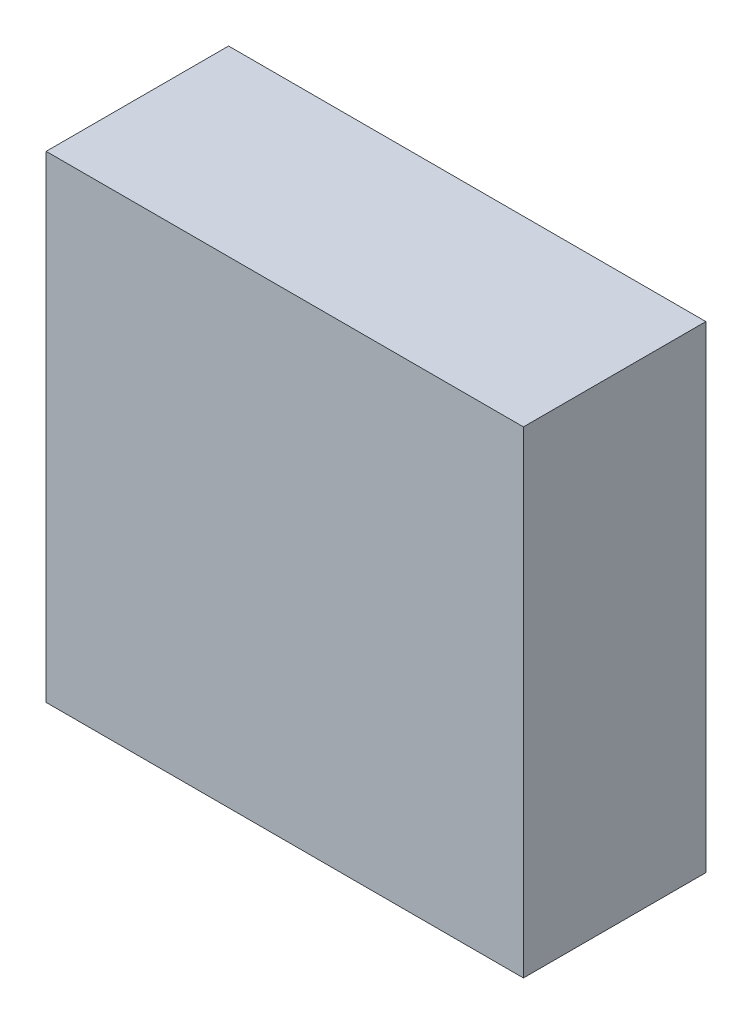
ISO-10303-21;
HEADER;
FILE_DESCRIPTION(('STEP AP214'),'2;1');
FILE_NAME('part.step','',(''),(''),'','','');
FILE_SCHEMA(('AUTOMOTIVE_DESIGN { 1 0 10303 214 1 1 1 1 }'));
ENDSEC;
DATA;
#1=APPLICATION_CONTEXT('core data for automotive mechanical design processes');
#2=APPLICATION_PROTOCOL_DEFINITION('international standard','automotive_design',2000,#1);
#3=PRODUCT_CONTEXT('',#1,'mechanical');
#4=PRODUCT('Part','Part','',(#3));
#5=PRODUCT_RELATED_PRODUCT_CATEGORY('part','',(#4));
#6=PRODUCT_DEFINITION_FORMATION('','',#4);
#7=PRODUCT_DEFINITION_CONTEXT('part definition',#1,'design');
#8=PRODUCT_DEFINITION('design','',#6,#7);
#9=PRODUCT_DEFINITION_SHAPE('','',#8);
#10=(LENGTH_UNIT() NAMED_UNIT(*) SI_UNIT(.MILLI.,.METRE.));
#11=(NAMED_UNIT(*) PLANE_ANGLE_UNIT() SI_UNIT($,.RADIAN.));
#12=(NAMED_UNIT(*) SI_UNIT($,.STERADIAN.) SOLID_ANGLE_UNIT());
#13=UNCERTAINTY_MEASURE_WITH_UNIT(LENGTH_MEASURE(1.E-05),#10,'distance_accuracy_value','');
#14=(GEOMETRIC_REPRESENTATION_CONTEXT(3) GLOBAL_UNCERTAINTY_ASSIGNED_CONTEXT((#13)) GLOBAL_UNIT_ASSIGNED_CONTEXT((#10,
#11,#12)) REPRESENTATION_CONTEXT('',''));
#15=CARTESIAN_POINT('',(0.,0.,0.));
#16=DIRECTION('',(0.,0.,1.));
#17=DIRECTION('',(1.,0.,0.));
#18=AXIS2_PLACEMENT_3D('',#15,#16,#17);
#19=CARTESIAN_POINT('',(-1.27,-1.27,1.));
#20=DIRECTION('',(1.,0.,0.));
#21=DIRECTION('',(0.,0.,-1.));
#22=AXIS2_PLACEMENT_3D('',#19,#20,#21);
#23=PLANE('',#22);
#24=DIRECTION('',(0.,-1.,0.));
#25=VECTOR('',#24,1.);
#26=CARTESIAN_POINT('',(-1.27,-1.27,0.));
#27=LINE('',#26,#25);
#28=CARTESIAN_POINT('',(-1.27,1.3462,0.));
#29=VERTEX_POINT('',#28);
#30=CARTESIAN_POINT('',(-1.27,-1.27,0.));
#31=VERTEX_POINT('',#30);
#32=EDGE_CURVE('E95',#29,#31,#27,.T.);
#33=ORIENTED_EDGE('',*,*,#32,.T.);
#34=DIRECTION('',(0.,0.,-1.));
#35=VECTOR('',#34,1.);
#36=CARTESIAN_POINT('',(-1.27,-1.27,1.));
#37=LINE('',#36,#35);
#38=CARTESIAN_POINT('',(-1.27,-1.27,1.));
#39=VERTEX_POINT('',#38);
#40=EDGE_CURVE('E11',#39,#31,#37,.T.);
#41=ORIENTED_EDGE('',*,*,#40,.F.);
#42=DIRECTION('',(0.,-1.,0.));
#43=VECTOR('',#42,1.);
#44=CARTESIAN_POINT('',(-1.27,-1.27,1.));
#45=LINE('',#44,#43);
#46=CARTESIAN_POINT('',(-1.27,1.3462,1.));
#47=VERTEX_POINT('',#46);
#48=EDGE_CURVE('E83',#47,#39,#45,.T.);
#49=ORIENTED_EDGE('',*,*,#48,.F.);
#50=DIRECTION('',(0.,0.,-1.));
#51=VECTOR('',#50,1.);
#52=CARTESIAN_POINT('',(-1.27,1.3462,1.));
#53=LINE('',#52,#51);
#54=EDGE_CURVE('E91',#47,#29,#53,.T.);
#55=ORIENTED_EDGE('',*,*,#54,.T.);
#56=EDGE_LOOP('',(#33,#41,#49,#55));
#57=FACE_BOUND('',#56,.T.);
#58=ADVANCED_FACE('F32',(#57),#23,.F.);
#59=CARTESIAN_POINT('',(1.3462,-1.27,1.));
#60=DIRECTION('',(0.,1.,0.));
#61=DIRECTION('',(0.,0.,1.));
#62=AXIS2_PLACEMENT_3D('',#59,#60,#61);
#63=PLANE('',#62);
#64=DIRECTION('',(1.,0.,0.));
#65=VECTOR('',#64,1.);
#66=CARTESIAN_POINT('',(1.3462,-1.27,0.));
#67=LINE('',#66,#65);
#68=CARTESIAN_POINT('',(1.3462,-1.27,0.));
#69=VERTEX_POINT('',#68);
#70=EDGE_CURVE('E87',#31,#69,#67,.T.);
#71=ORIENTED_EDGE('',*,*,#70,.T.);
#72=DIRECTION('',(0.,0.,-1.));
#73=VECTOR('',#72,1.);
#74=CARTESIAN_POINT('',(1.3462,-1.27,1.));
#75=LINE('',#74,#73);
#76=CARTESIAN_POINT('',(1.3462,-1.27,1.));
#77=VERTEX_POINT('',#76);
#78=EDGE_CURVE('E40',#77,#69,#75,.T.);
#79=ORIENTED_EDGE('',*,*,#78,.F.);
#80=DIRECTION('',(1.,0.,0.));
#81=VECTOR('',#80,1.);
#82=CARTESIAN_POINT('',(1.3462,-1.27,1.));
#83=LINE('',#82,#81);
#84=EDGE_CURVE('E78',#39,#77,#83,.T.);
#85=ORIENTED_EDGE('',*,*,#84,.F.);
#86=ORIENTED_EDGE('',*,*,#40,.T.);
#87=EDGE_LOOP('',(#71,#79,#85,#86));
#88=FACE_BOUND('',#87,.T.);
#89=ADVANCED_FACE('F86',(#88),#63,.F.);
#90=CARTESIAN_POINT('',(1.3462,1.3462,1.));
#91=DIRECTION('',(-1.,0.,0.));
#92=DIRECTION('',(0.,0.,1.));
#93=AXIS2_PLACEMENT_3D('',#90,#91,#92);
#94=PLANE('',#93);
#95=DIRECTION('',(0.,1.,0.));
#96=VECTOR('',#95,1.);
#97=CARTESIAN_POINT('',(1.3462,1.3462,0.));
#98=LINE('',#97,#96);
#99=CARTESIAN_POINT('',(1.3462,1.3462,0.));
#100=VERTEX_POINT('',#99);
#101=EDGE_CURVE('E65',#69,#100,#98,.T.);
#102=ORIENTED_EDGE('',*,*,#101,.T.);
#103=DIRECTION('',(0.,0.,-1.));
#104=VECTOR('',#103,1.);
#105=CARTESIAN_POINT('',(1.3462,1.3462,1.));
#106=LINE('',#105,#104);
#107=CARTESIAN_POINT('',(1.3462,1.3462,1.));
#108=VERTEX_POINT('',#107);
#109=EDGE_CURVE('E88',#108,#100,#106,.T.);
#110=ORIENTED_EDGE('',*,*,#109,.F.);
#111=DIRECTION('',(0.,1.,0.));
#112=VECTOR('',#111,1.);
#113=CARTESIAN_POINT('',(1.3462,1.3462,1.));
#114=LINE('',#113,#112);
#115=EDGE_CURVE('E81',#77,#108,#114,.T.);
#116=ORIENTED_EDGE('',*,*,#115,.F.);
#117=ORIENTED_EDGE('',*,*,#78,.T.);
#118=EDGE_LOOP('',(#102,#110,#116,#117));
#119=FACE_BOUND('',#118,.T.);
#120=ADVANCED_FACE('F89',(#119),#94,.F.);
#121=CARTESIAN_POINT('',(-1.27,1.3462,1.));
#122=DIRECTION('',(0.,-1.,0.));
#123=DIRECTION('',(0.,0.,-1.));
#124=AXIS2_PLACEMENT_3D('',#121,#122,#123);
#125=PLANE('',#124);
#126=DIRECTION('',(-1.,0.,0.));
#127=VECTOR('',#126,1.);
#128=CARTESIAN_POINT('',(-1.27,1.3462,0.));
#129=LINE('',#128,#127);
#130=EDGE_CURVE('E71',#100,#29,#129,.T.);
#131=ORIENTED_EDGE('',*,*,#130,.T.);
#132=ORIENTED_EDGE('',*,*,#54,.F.);
#133=DIRECTION('',(-1.,0.,0.));
#134=VECTOR('',#133,1.);
#135=CARTESIAN_POINT('',(-1.27,1.3462,1.));
#136=LINE('',#135,#134);
#137=EDGE_CURVE('E48',#108,#47,#136,.T.);
#138=ORIENTED_EDGE('',*,*,#137,.F.);
#139=ORIENTED_EDGE('',*,*,#109,.T.);
#140=EDGE_LOOP('',(#131,#132,#138,#139));
#141=FACE_BOUND('',#140,.T.);
#142=ADVANCED_FACE('F102',(#141),#125,.F.);
#143=CARTESIAN_POINT('',(0.,0.,1.));
#144=DIRECTION('',(0.,0.,-1.));
#145=DIRECTION('',(-1.,0.,0.));
#146=AXIS2_PLACEMENT_3D('',#143,#144,#145);
#147=PLANE('',#146);
#148=ORIENTED_EDGE('',*,*,#48,.T.);
#149=ORIENTED_EDGE('',*,*,#84,.T.);
#150=ORIENTED_EDGE('',*,*,#115,.T.);
#151=ORIENTED_EDGE('',*,*,#137,.T.);
#152=EDGE_LOOP('',(#148,#149,#150,#151));
#153=FACE_BOUND('',#152,.T.);
#154=ADVANCED_FACE('F79',(#153),#147,.F.);
#155=CARTESIAN_POINT('',(0.,0.,0.));
#156=DIRECTION('',(0.,0.,-1.));
#157=DIRECTION('',(-1.,0.,0.));
#158=AXIS2_PLACEMENT_3D('',#155,#156,#157);
#159=PLANE('',#158);
#160=ORIENTED_EDGE('',*,*,#32,.F.);
#161=ORIENTED_EDGE('',*,*,#130,.F.);
#162=ORIENTED_EDGE('',*,*,#101,.F.);
#163=ORIENTED_EDGE('',*,*,#70,.F.);
#164=EDGE_LOOP('',(#160,#161,#162,#163));
#165=FACE_BOUND('',#164,.T.);
#166=ADVANCED_FACE('F105',(#165),#159,.T.);
#167=CLOSED_SHELL('',(#58,#89,#120,#142,#154,#166));
#168=MANIFOLD_SOLID_BREP('B2',#167);
#169=ADVANCED_BREP_SHAPE_REPRESENTATION('',(#18,#168),#14);
#170=SHAPE_DEFINITION_REPRESENTATION(#9,#169);
ENDSEC;
END-ISO-10303-21;
